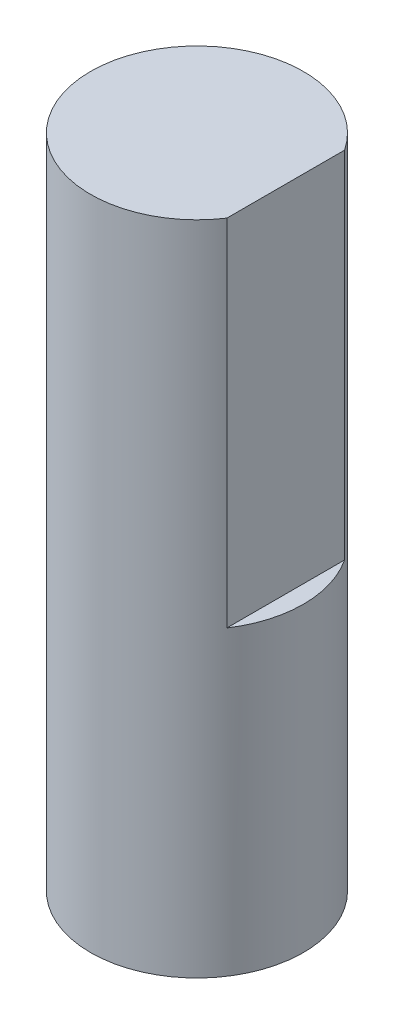
ISO-10303-21;
HEADER;
FILE_DESCRIPTION(('STEP AP214'),'2;1');
FILE_NAME('part.step','',(''),(''),'','','');
FILE_SCHEMA(('AUTOMOTIVE_DESIGN { 1 0 10303 214 1 1 1 1 }'));
ENDSEC;
DATA;
#1=APPLICATION_CONTEXT('core data for automotive mechanical design processes');
#2=APPLICATION_PROTOCOL_DEFINITION('international standard','automotive_design',2000,#1);
#3=PRODUCT_CONTEXT('',#1,'mechanical');
#4=PRODUCT('Part','Part','',(#3));
#5=PRODUCT_RELATED_PRODUCT_CATEGORY('part','',(#4));
#6=PRODUCT_DEFINITION_FORMATION('','',#4);
#7=PRODUCT_DEFINITION_CONTEXT('part definition',#1,'design');
#8=PRODUCT_DEFINITION('design','',#6,#7);
#9=PRODUCT_DEFINITION_SHAPE('','',#8);
#10=(LENGTH_UNIT() NAMED_UNIT(*) SI_UNIT(.MILLI.,.METRE.));
#11=(NAMED_UNIT(*) PLANE_ANGLE_UNIT() SI_UNIT($,.RADIAN.));
#12=(NAMED_UNIT(*) SI_UNIT($,.STERADIAN.) SOLID_ANGLE_UNIT());
#13=UNCERTAINTY_MEASURE_WITH_UNIT(LENGTH_MEASURE(1.E-05),#10,'distance_accuracy_value','');
#14=(GEOMETRIC_REPRESENTATION_CONTEXT(3) GLOBAL_UNCERTAINTY_ASSIGNED_CONTEXT((#13)) GLOBAL_UNIT_ASSIGNED_CONTEXT((#10,
#11,#12)) REPRESENTATION_CONTEXT('',''));
#15=CARTESIAN_POINT('',(0.,0.,0.));
#16=DIRECTION('',(0.,0.,1.));
#17=DIRECTION('',(1.,0.,0.));
#18=AXIS2_PLACEMENT_3D('',#15,#16,#17);
#19=CARTESIAN_POINT('',(0.,18.5,0.));
#20=DIRECTION('',(0.,-1.,0.));
#21=DIRECTION('',(0.,0.,-1.));
#22=AXIS2_PLACEMENT_3D('',#19,#20,#21);
#23=CYLINDRICAL_SURFACE('',#22,3.);
#24=CARTESIAN_POINT('',(0.,18.5,0.));
#25=DIRECTION('',(0.,1.,0.));
#26=DIRECTION('',(0.,0.,1.));
#27=AXIS2_PLACEMENT_3D('',#24,#25,#26);
#28=CIRCLE('',#27,3.);
#29=CARTESIAN_POINT('',(2.5,18.5,-1.6583123951777));
#30=VERTEX_POINT('',#29);
#31=CARTESIAN_POINT('',(2.5,18.5,1.6583123951777));
#32=VERTEX_POINT('',#31);
#33=EDGE_CURVE('E11',#30,#32,#28,.T.);
#34=ORIENTED_EDGE('',*,*,#33,.F.);
#35=DIRECTION('',(0.,1.,0.));
#36=VECTOR('',#35,1.);
#37=CARTESIAN_POINT('',(2.5,8.5,-1.6583123951777));
#38=LINE('',#37,#36);
#39=CARTESIAN_POINT('',(2.5,8.5,-1.6583123951777));
#40=VERTEX_POINT('',#39);
#41=EDGE_CURVE('E62',#40,#30,#38,.T.);
#42=ORIENTED_EDGE('',*,*,#41,.F.);
#43=CARTESIAN_POINT('',(0.,8.5,0.));
#44=DIRECTION('',(0.,1.,0.));
#45=DIRECTION('',(0.,0.,1.));
#46=AXIS2_PLACEMENT_3D('',#43,#44,#45);
#47=CIRCLE('',#46,3.);
#48=CARTESIAN_POINT('',(2.5,8.5,1.6583123951777));
#49=VERTEX_POINT('',#48);
#50=EDGE_CURVE('E78',#49,#40,#47,.T.);
#51=ORIENTED_EDGE('',*,*,#50,.F.);
#52=DIRECTION('',(0.,1.,0.));
#53=VECTOR('',#52,1.);
#54=CARTESIAN_POINT('',(2.5,8.5,1.6583123951777));
#55=LINE('',#54,#53);
#56=EDGE_CURVE('E68',#49,#32,#55,.T.);
#57=ORIENTED_EDGE('',*,*,#56,.T.);
#58=EDGE_LOOP('',(#34,#42,#51,#57));
#59=FACE_BOUND('',#58,.T.);
#60=CARTESIAN_POINT('',(0.,0.,0.));
#61=DIRECTION('',(0.,1.,0.));
#62=DIRECTION('',(0.,0.,1.));
#63=AXIS2_PLACEMENT_3D('',#60,#61,#62);
#64=CIRCLE('',#63,3.);
#65=CARTESIAN_POINT('',(0.,0.,3.));
#66=VERTEX_POINT('',#65);
#67=EDGE_CURVE('E50',#66,#66,#64,.T.);
#68=ORIENTED_EDGE('',*,*,#67,.T.);
#69=EDGE_LOOP('',(#68));
#70=FACE_BOUND('',#69,.T.);
#71=ADVANCED_FACE('F47',(#59,#70),#23,.T.);
#72=CARTESIAN_POINT('',(0.,18.5,0.));
#73=DIRECTION('',(0.,1.,0.));
#74=DIRECTION('',(0.,0.,1.));
#75=AXIS2_PLACEMENT_3D('',#72,#73,#74);
#76=PLANE('',#75);
#77=DIRECTION('',(0.,0.,1.));
#78=VECTOR('',#77,1.);
#79=CARTESIAN_POINT('',(2.5,18.5,-1.6583123951777));
#80=LINE('',#79,#78);
#81=EDGE_CURVE('E73',#30,#32,#80,.T.);
#82=ORIENTED_EDGE('',*,*,#81,.F.);
#83=ORIENTED_EDGE('',*,*,#33,.T.);
#84=EDGE_LOOP('',(#82,#83));
#85=FACE_BOUND('',#84,.T.);
#86=ADVANCED_FACE('F85',(#85),#76,.T.);
#87=CARTESIAN_POINT('',(0.,0.,0.));
#88=DIRECTION('',(0.,1.,0.));
#89=DIRECTION('',(0.,0.,1.));
#90=AXIS2_PLACEMENT_3D('',#87,#88,#89);
#91=PLANE('',#90);
#92=ORIENTED_EDGE('',*,*,#67,.F.);
#93=EDGE_LOOP('',(#92));
#94=FACE_BOUND('',#93,.T.);
#95=ADVANCED_FACE('F87',(#94),#91,.F.);
#96=CARTESIAN_POINT('',(2.5,8.5,-1.6583123951777));
#97=DIRECTION('',(-1.,0.,0.));
#98=DIRECTION('',(0.,0.,1.));
#99=AXIS2_PLACEMENT_3D('',#96,#97,#98);
#100=PLANE('',#99);
#101=ORIENTED_EDGE('',*,*,#81,.T.);
#102=ORIENTED_EDGE('',*,*,#56,.F.);
#103=DIRECTION('',(0.,0.,1.));
#104=VECTOR('',#103,1.);
#105=CARTESIAN_POINT('',(2.5,8.5,-1.6583123951777));
#106=LINE('',#105,#104);
#107=EDGE_CURVE('E102',#40,#49,#106,.T.);
#108=ORIENTED_EDGE('',*,*,#107,.F.);
#109=ORIENTED_EDGE('',*,*,#41,.T.);
#110=EDGE_LOOP('',(#101,#102,#108,#109));
#111=FACE_BOUND('',#110,.T.);
#112=ADVANCED_FACE('F74',(#111),#100,.F.);
#113=CARTESIAN_POINT('',(0.,8.5,0.));
#114=DIRECTION('',(0.,1.,0.));
#115=DIRECTION('',(0.,0.,1.));
#116=AXIS2_PLACEMENT_3D('',#113,#114,#115);
#117=PLANE('',#116);
#118=ORIENTED_EDGE('',*,*,#50,.T.);
#119=ORIENTED_EDGE('',*,*,#107,.T.);
#120=EDGE_LOOP('',(#118,#119));
#121=FACE_BOUND('',#120,.T.);
#122=ADVANCED_FACE('F96',(#121),#117,.T.);
#123=CLOSED_SHELL('',(#71,#86,#95,#112,#122));
#124=MANIFOLD_SOLID_BREP('B2',#123);
#125=ADVANCED_BREP_SHAPE_REPRESENTATION('',(#18,#124),#14);
#126=SHAPE_DEFINITION_REPRESENTATION(#9,#125);
ENDSEC;
END-ISO-10303-21;
